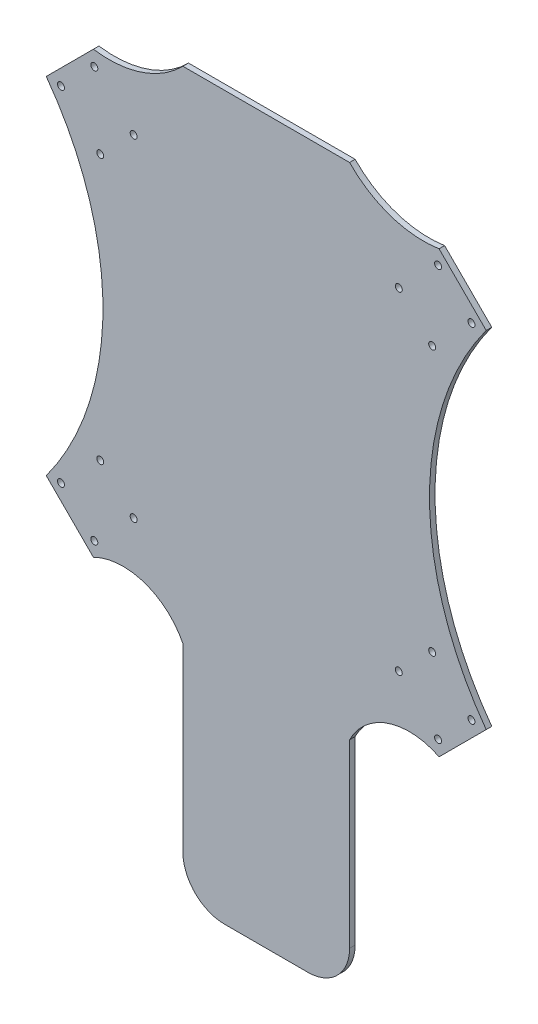
ISO-10303-21;
HEADER;
FILE_DESCRIPTION(('STEP AP214'),'2;1');
FILE_NAME('part.step','',(''),(''),'','','');
FILE_SCHEMA(('AUTOMOTIVE_DESIGN { 1 0 10303 214 1 1 1 1 }'));
ENDSEC;
DATA;
#1=APPLICATION_CONTEXT('core data for automotive mechanical design processes');
#2=APPLICATION_PROTOCOL_DEFINITION('international standard','automotive_design',2000,#1);
#3=PRODUCT_CONTEXT('',#1,'mechanical');
#4=PRODUCT('Part','Part','',(#3));
#5=PRODUCT_RELATED_PRODUCT_CATEGORY('part','',(#4));
#6=PRODUCT_DEFINITION_FORMATION('','',#4);
#7=PRODUCT_DEFINITION_CONTEXT('part definition',#1,'design');
#8=PRODUCT_DEFINITION('design','',#6,#7);
#9=PRODUCT_DEFINITION_SHAPE('','',#8);
#10=(LENGTH_UNIT() NAMED_UNIT(*) SI_UNIT(.MILLI.,.METRE.));
#11=(NAMED_UNIT(*) PLANE_ANGLE_UNIT() SI_UNIT($,.RADIAN.));
#12=(NAMED_UNIT(*) SI_UNIT($,.STERADIAN.) SOLID_ANGLE_UNIT());
#13=UNCERTAINTY_MEASURE_WITH_UNIT(LENGTH_MEASURE(1.E-05),#10,'distance_accuracy_value','');
#14=(GEOMETRIC_REPRESENTATION_CONTEXT(3) GLOBAL_UNCERTAINTY_ASSIGNED_CONTEXT((#13)) GLOBAL_UNIT_ASSIGNED_CONTEXT((#10,
#11,#12)) REPRESENTATION_CONTEXT('',''));
#15=CARTESIAN_POINT('',(0.,0.,0.));
#16=DIRECTION('',(0.,0.,1.));
#17=DIRECTION('',(1.,0.,0.));
#18=AXIS2_PLACEMENT_3D('',#15,#16,#17);
#19=CARTESIAN_POINT('',(70.710678118655,70.7106781186545,2.));
#20=DIRECTION('',(-0.70710678118655,-0.707106781186545,0.));
#21=DIRECTION('',(0.707106781186545,-0.70710678118655,0.));
#22=AXIS2_PLACEMENT_3D('',#19,#20,#21);
#23=PLANE('',#22);
#24=DIRECTION('',(-0.707106781186545,0.70710678118655,0.));
#25=VECTOR('',#24,1.);
#26=CARTESIAN_POINT('',(70.710678118655,70.7106781186545,0.));
#27=LINE('',#26,#25);
#28=CARTESIAN_POINT('',(79.1959594928695,62.2253967444399,0.));
#29=VERTEX_POINT('',#28);
#30=CARTESIAN_POINT('',(62.2253967444404,79.1959594928692,0.));
#31=VERTEX_POINT('',#30);
#32=EDGE_CURVE('E179',#29,#31,#27,.T.);
#33=ORIENTED_EDGE('',*,*,#32,.T.);
#34=DIRECTION('',(0.,0.,-1.));
#35=VECTOR('',#34,1.);
#36=CARTESIAN_POINT('',(62.2253967444404,79.1959594928692,2.));
#37=LINE('',#36,#35);
#38=CARTESIAN_POINT('',(62.2253967444404,79.1959594928692,2.));
#39=VERTEX_POINT('',#38);
#40=EDGE_CURVE('E11',#39,#31,#37,.T.);
#41=ORIENTED_EDGE('',*,*,#40,.F.);
#42=DIRECTION('',(-0.707106781186545,0.70710678118655,0.));
#43=VECTOR('',#42,1.);
#44=CARTESIAN_POINT('',(70.710678118655,70.7106781186545,2.));
#45=LINE('',#44,#43);
#46=CARTESIAN_POINT('',(79.1959594928695,62.2253967444399,2.));
#47=VERTEX_POINT('',#46);
#48=EDGE_CURVE('E219',#47,#39,#45,.T.);
#49=ORIENTED_EDGE('',*,*,#48,.F.);
#50=DIRECTION('',(0.,0.,-1.));
#51=VECTOR('',#50,1.);
#52=CARTESIAN_POINT('',(79.1959594928695,62.2253967444399,2.));
#53=LINE('',#52,#51);
#54=EDGE_CURVE('E51',#47,#29,#53,.T.);
#55=ORIENTED_EDGE('',*,*,#54,.T.);
#56=EDGE_LOOP('',(#33,#41,#49,#55));
#57=FACE_BOUND('',#56,.T.);
#58=ADVANCED_FACE('F35',(#57),#23,.F.);
#59=CARTESIAN_POINT('',(56.6326353834585,115.975976125653,2.));
#60=DIRECTION('',(0.,0.,-1.));
#61=DIRECTION('',(-1.,0.,0.));
#62=AXIS2_PLACEMENT_3D('',#59,#60,#61);
#63=CYLINDRICAL_SURFACE('',#62,37.2028037001073);
#64=CARTESIAN_POINT('',(56.6326353834585,115.975976125653,0.));
#65=DIRECTION('',(0.,0.,1.));
#66=DIRECTION('',(1.,0.,0.));
#67=AXIS2_PLACEMENT_3D('',#64,#65,#66);
#68=CIRCLE('',#67,37.2028037001073);
#69=CARTESIAN_POINT('',(30.,90.,0.));
#70=VERTEX_POINT('',#69);
#71=EDGE_CURVE('E181',#31,#70,#68,.F.);
#72=ORIENTED_EDGE('',*,*,#71,.T.);
#73=DIRECTION('',(0.,0.,-1.));
#74=VECTOR('',#73,1.);
#75=CARTESIAN_POINT('',(30.,90.,2.));
#76=LINE('',#75,#74);
#77=CARTESIAN_POINT('',(30.,90.,2.));
#78=VERTEX_POINT('',#77);
#79=EDGE_CURVE('E43',#78,#70,#76,.T.);
#80=ORIENTED_EDGE('',*,*,#79,.F.);
#81=CARTESIAN_POINT('',(56.6326353834585,115.975976125653,2.));
#82=DIRECTION('',(0.,0.,1.));
#83=DIRECTION('',(1.,0.,0.));
#84=AXIS2_PLACEMENT_3D('',#81,#82,#83);
#85=CIRCLE('',#84,37.2028037001073);
#86=EDGE_CURVE('E113',#39,#78,#85,.F.);
#87=ORIENTED_EDGE('',*,*,#86,.F.);
#88=ORIENTED_EDGE('',*,*,#40,.T.);
#89=EDGE_LOOP('',(#72,#80,#87,#88));
#90=FACE_BOUND('',#89,.T.);
#91=ADVANCED_FACE('F302',(#90),#63,.F.);
#92=CARTESIAN_POINT('',(0.,90.,2.));
#93=DIRECTION('',(0.,-1.,0.));
#94=DIRECTION('',(0.,0.,-1.));
#95=AXIS2_PLACEMENT_3D('',#92,#93,#94);
#96=PLANE('',#95);
#97=DIRECTION('',(-1.,0.,0.));
#98=VECTOR('',#97,1.);
#99=CARTESIAN_POINT('',(0.,90.,0.));
#100=LINE('',#99,#98);
#101=CARTESIAN_POINT('',(-30.,90.,0.));
#102=VERTEX_POINT('',#101);
#103=EDGE_CURVE('E184',#70,#102,#100,.T.);
#104=ORIENTED_EDGE('',*,*,#103,.T.);
#105=DIRECTION('',(0.,0.,-1.));
#106=VECTOR('',#105,1.);
#107=CARTESIAN_POINT('',(-30.,90.,2.));
#108=LINE('',#107,#106);
#109=CARTESIAN_POINT('',(-30.,90.,2.));
#110=VERTEX_POINT('',#109);
#111=EDGE_CURVE('E245',#110,#102,#108,.T.);
#112=ORIENTED_EDGE('',*,*,#111,.F.);
#113=DIRECTION('',(-1.,0.,0.));
#114=VECTOR('',#113,1.);
#115=CARTESIAN_POINT('',(0.,90.,2.));
#116=LINE('',#115,#114);
#117=EDGE_CURVE('E252',#78,#110,#116,.T.);
#118=ORIENTED_EDGE('',*,*,#117,.F.);
#119=ORIENTED_EDGE('',*,*,#79,.T.);
#120=EDGE_LOOP('',(#104,#112,#118,#119));
#121=FACE_BOUND('',#120,.T.);
#122=ADVANCED_FACE('F250',(#121),#96,.F.);
#123=CARTESIAN_POINT('',(-56.6326353834585,115.975976125653,2.));
#124=DIRECTION('',(0.,0.,-1.));
#125=DIRECTION('',(-1.,0.,0.));
#126=AXIS2_PLACEMENT_3D('',#123,#124,#125);
#127=CYLINDRICAL_SURFACE('',#126,37.2028037001073);
#128=CARTESIAN_POINT('',(-56.6326353834585,115.975976125653,0.));
#129=DIRECTION('',(0.,0.,1.));
#130=DIRECTION('',(1.,0.,0.));
#131=AXIS2_PLACEMENT_3D('',#128,#129,#130);
#132=CIRCLE('',#131,37.2028037001073);
#133=CARTESIAN_POINT('',(-62.2253967444404,79.1959594928692,0.));
#134=VERTEX_POINT('',#133);
#135=EDGE_CURVE('E187',#134,#102,#132,.T.);
#136=ORIENTED_EDGE('',*,*,#135,.F.);
#137=DIRECTION('',(0.,0.,-1.));
#138=VECTOR('',#137,1.);
#139=CARTESIAN_POINT('',(-62.2253967444404,79.1959594928692,2.));
#140=LINE('',#139,#138);
#141=CARTESIAN_POINT('',(-62.2253967444404,79.1959594928692,2.));
#142=VERTEX_POINT('',#141);
#143=EDGE_CURVE('E243',#142,#134,#140,.T.);
#144=ORIENTED_EDGE('',*,*,#143,.F.);
#145=CARTESIAN_POINT('',(-56.6326353834585,115.975976125653,2.));
#146=DIRECTION('',(0.,0.,1.));
#147=DIRECTION('',(1.,0.,0.));
#148=AXIS2_PLACEMENT_3D('',#145,#146,#147);
#149=CIRCLE('',#148,37.2028037001073);
#150=EDGE_CURVE('E262',#142,#110,#149,.T.);
#151=ORIENTED_EDGE('',*,*,#150,.T.);
#152=ORIENTED_EDGE('',*,*,#111,.T.);
#153=EDGE_LOOP('',(#136,#144,#151,#152));
#154=FACE_BOUND('',#153,.T.);
#155=ADVANCED_FACE('F259',(#154),#127,.F.);
#156=CARTESIAN_POINT('',(-70.710678118655,70.7106781186545,2.));
#157=DIRECTION('',(-0.70710678118655,0.707106781186545,0.));
#158=DIRECTION('',(-0.707106781186545,-0.70710678118655,0.));
#159=AXIS2_PLACEMENT_3D('',#156,#157,#158);
#160=PLANE('',#159);
#161=DIRECTION('',(0.707106781186545,0.70710678118655,0.));
#162=VECTOR('',#161,1.);
#163=CARTESIAN_POINT('',(-70.710678118655,70.7106781186545,0.));
#164=LINE('',#163,#162);
#165=CARTESIAN_POINT('',(-79.1959594928695,62.2253967444399,0.));
#166=VERTEX_POINT('',#165);
#167=EDGE_CURVE('E190',#166,#134,#164,.T.);
#168=ORIENTED_EDGE('',*,*,#167,.F.);
#169=DIRECTION('',(0.,0.,-1.));
#170=VECTOR('',#169,1.);
#171=CARTESIAN_POINT('',(-79.1959594928695,62.2253967444399,2.));
#172=LINE('',#171,#170);
#173=CARTESIAN_POINT('',(-79.1959594928695,62.2253967444399,2.));
#174=VERTEX_POINT('',#173);
#175=EDGE_CURVE('E241',#174,#166,#172,.T.);
#176=ORIENTED_EDGE('',*,*,#175,.F.);
#177=DIRECTION('',(0.707106781186545,0.70710678118655,0.));
#178=VECTOR('',#177,1.);
#179=CARTESIAN_POINT('',(-70.710678118655,70.7106781186545,2.));
#180=LINE('',#179,#178);
#181=EDGE_CURVE('E265',#174,#142,#180,.T.);
#182=ORIENTED_EDGE('',*,*,#181,.T.);
#183=ORIENTED_EDGE('',*,*,#143,.T.);
#184=EDGE_LOOP('',(#168,#176,#182,#183));
#185=FACE_BOUND('',#184,.T.);
#186=ADVANCED_FACE('F725',(#185),#160,.T.);
#187=CARTESIAN_POINT('',(-163.82245815415,-1.60235533378204E-13,2.));
#188=DIRECTION('',(0.,0.,-1.));
#189=DIRECTION('',(-1.,0.,0.));
#190=AXIS2_PLACEMENT_3D('',#187,#188,#189);
#191=CYLINDRICAL_SURFACE('',#190,105.04115515202);
#192=CARTESIAN_POINT('',(-163.82245815415,-1.60235533378204E-13,0.));
#193=DIRECTION('',(0.,0.,1.));
#194=DIRECTION('',(1.,0.,0.));
#195=AXIS2_PLACEMENT_3D('',#192,#193,#194);
#196=CIRCLE('',#195,105.04115515202);
#197=CARTESIAN_POINT('',(-79.1959594928692,-62.2253967444403,0.));
#198=VERTEX_POINT('',#197);
#199=EDGE_CURVE('E193',#166,#198,#196,.F.);
#200=ORIENTED_EDGE('',*,*,#199,.T.);
#201=DIRECTION('',(0.,0.,-1.));
#202=VECTOR('',#201,1.);
#203=CARTESIAN_POINT('',(-79.1959594928692,-62.2253967444403,2.));
#204=LINE('',#203,#202);
#205=CARTESIAN_POINT('',(-79.1959594928692,-62.2253967444403,2.));
#206=VERTEX_POINT('',#205);
#207=EDGE_CURVE('E238',#206,#198,#204,.T.);
#208=ORIENTED_EDGE('',*,*,#207,.F.);
#209=CARTESIAN_POINT('',(-163.82245815415,-1.60235533378204E-13,2.));
#210=DIRECTION('',(0.,0.,1.));
#211=DIRECTION('',(1.,0.,0.));
#212=AXIS2_PLACEMENT_3D('',#209,#210,#211);
#213=CIRCLE('',#212,105.04115515202);
#214=EDGE_CURVE('E267',#174,#206,#213,.F.);
#215=ORIENTED_EDGE('',*,*,#214,.F.);
#216=ORIENTED_EDGE('',*,*,#175,.T.);
#217=EDGE_LOOP('',(#200,#208,#215,#216));
#218=FACE_BOUND('',#217,.T.);
#219=ADVANCED_FACE('F716',(#218),#191,.F.);
#220=CARTESIAN_POINT('',(-70.7106781186544,-70.7106781186551,2.));
#221=DIRECTION('',(0.707106781186544,0.707106781186551,0.));
#222=DIRECTION('',(-0.707106781186551,0.707106781186544,0.));
#223=AXIS2_PLACEMENT_3D('',#220,#221,#222);
#224=PLANE('',#223);
#225=DIRECTION('',(0.707106781186551,-0.707106781186544,0.));
#226=VECTOR('',#225,1.);
#227=CARTESIAN_POINT('',(-70.7106781186544,-70.7106781186551,0.));
#228=LINE('',#227,#226);
#229=CARTESIAN_POINT('',(-62.2253967444395,-79.1959594928698,0.));
#230=VERTEX_POINT('',#229);
#231=EDGE_CURVE('E195',#198,#230,#228,.T.);
#232=ORIENTED_EDGE('',*,*,#231,.T.);
#233=DIRECTION('',(0.,0.,-1.));
#234=VECTOR('',#233,1.);
#235=CARTESIAN_POINT('',(-62.2253967444395,-79.1959594928698,2.));
#236=LINE('',#235,#234);
#237=CARTESIAN_POINT('',(-62.2253967444395,-79.1959594928698,2.));
#238=VERTEX_POINT('',#237);
#239=EDGE_CURVE('E235',#238,#230,#236,.T.);
#240=ORIENTED_EDGE('',*,*,#239,.F.);
#241=DIRECTION('',(0.707106781186551,-0.707106781186544,0.));
#242=VECTOR('',#241,1.);
#243=CARTESIAN_POINT('',(-70.7106781186544,-70.7106781186551,2.));
#244=LINE('',#243,#242);
#245=EDGE_CURVE('E273',#206,#238,#244,.T.);
#246=ORIENTED_EDGE('',*,*,#245,.F.);
#247=ORIENTED_EDGE('',*,*,#207,.T.);
#248=EDGE_LOOP('',(#232,#240,#246,#247));
#249=FACE_BOUND('',#248,.T.);
#250=ADVANCED_FACE('F707',(#249),#224,.F.);
#251=CARTESIAN_POINT('',(-51.5147186257848,-100.710678118655,2.));
#252=DIRECTION('',(0.,0.,-1.));
#253=DIRECTION('',(-1.,0.,0.));
#254=AXIS2_PLACEMENT_3D('',#251,#252,#253);
#255=CYLINDRICAL_SURFACE('',#254,24.0333464858334);
#256=CARTESIAN_POINT('',(-51.5147186257848,-100.710678118655,0.));
#257=DIRECTION('',(0.,0.,1.));
#258=DIRECTION('',(1.,0.,0.));
#259=AXIS2_PLACEMENT_3D('',#256,#257,#258);
#260=CIRCLE('',#259,24.0333464858334);
#261=CARTESIAN_POINT('',(-30.,-90.,0.));
#262=VERTEX_POINT('',#261);
#263=EDGE_CURVE('E197',#230,#262,#260,.F.);
#264=ORIENTED_EDGE('',*,*,#263,.T.);
#265=DIRECTION('',(0.,0.,-1.));
#266=VECTOR('',#265,1.);
#267=CARTESIAN_POINT('',(-30.,-90.,2.));
#268=LINE('',#267,#266);
#269=CARTESIAN_POINT('',(-30.,-90.,2.));
#270=VERTEX_POINT('',#269);
#271=EDGE_CURVE('E232',#270,#262,#268,.T.);
#272=ORIENTED_EDGE('',*,*,#271,.F.);
#273=CARTESIAN_POINT('',(-51.5147186257848,-100.710678118655,2.));
#274=DIRECTION('',(0.,0.,1.));
#275=DIRECTION('',(1.,0.,0.));
#276=AXIS2_PLACEMENT_3D('',#273,#274,#275);
#277=CIRCLE('',#276,24.0333464858334);
#278=EDGE_CURVE('E275',#238,#270,#277,.F.);
#279=ORIENTED_EDGE('',*,*,#278,.F.);
#280=ORIENTED_EDGE('',*,*,#239,.T.);
#281=EDGE_LOOP('',(#264,#272,#279,#280));
#282=FACE_BOUND('',#281,.T.);
#283=ADVANCED_FACE('F698',(#282),#255,.F.);
#284=CARTESIAN_POINT('',(-30.,0.,2.));
#285=DIRECTION('',(1.,0.,0.));
#286=DIRECTION('',(0.,1.,0.));
#287=AXIS2_PLACEMENT_3D('',#284,#285,#286);
#288=PLANE('',#287);
#289=DIRECTION('',(0.,-1.,0.));
#290=VECTOR('',#289,1.);
#291=CARTESIAN_POINT('',(-30.,0.,0.));
#292=LINE('',#291,#290);
#293=CARTESIAN_POINT('',(-30.,-155.,0.));
#294=VERTEX_POINT('',#293);
#295=EDGE_CURVE('E199',#262,#294,#292,.T.);
#296=ORIENTED_EDGE('',*,*,#295,.T.);
#297=DIRECTION('',(0.,0.,-1.));
#298=VECTOR('',#297,1.);
#299=CARTESIAN_POINT('',(-30.,-155.,2.));
#300=LINE('',#299,#298);
#301=CARTESIAN_POINT('',(-30.,-155.,2.));
#302=VERTEX_POINT('',#301);
#303=EDGE_CURVE('E230',#302,#294,#300,.T.);
#304=ORIENTED_EDGE('',*,*,#303,.F.);
#305=DIRECTION('',(0.,-1.,0.));
#306=VECTOR('',#305,1.);
#307=CARTESIAN_POINT('',(-30.,0.,2.));
#308=LINE('',#307,#306);
#309=EDGE_CURVE('E277',#270,#302,#308,.T.);
#310=ORIENTED_EDGE('',*,*,#309,.F.);
#311=ORIENTED_EDGE('',*,*,#271,.T.);
#312=EDGE_LOOP('',(#296,#304,#310,#311));
#313=FACE_BOUND('',#312,.T.);
#314=ADVANCED_FACE('F689',(#313),#288,.F.);
#315=CARTESIAN_POINT('',(-15.,-155.,2.));
#316=DIRECTION('',(0.,0.,-1.));
#317=DIRECTION('',(-1.,0.,0.));
#318=AXIS2_PLACEMENT_3D('',#315,#316,#317);
#319=CYLINDRICAL_SURFACE('',#318,15.);
#320=CARTESIAN_POINT('',(-15.,-155.,0.));
#321=DIRECTION('',(0.,0.,1.));
#322=DIRECTION('',(1.,0.,0.));
#323=AXIS2_PLACEMENT_3D('',#320,#321,#322);
#324=CIRCLE('',#323,15.);
#325=CARTESIAN_POINT('',(-14.9999999999999,-170.,0.));
#326=VERTEX_POINT('',#325);
#327=EDGE_CURVE('E202',#326,#294,#324,.F.);
#328=ORIENTED_EDGE('',*,*,#327,.F.);
#329=DIRECTION('',(0.,0.,-1.));
#330=VECTOR('',#329,1.);
#331=CARTESIAN_POINT('',(-14.9999999999999,-170.,2.));
#332=LINE('',#331,#330);
#333=CARTESIAN_POINT('',(-14.9999999999999,-170.,2.));
#334=VERTEX_POINT('',#333);
#335=EDGE_CURVE('E228',#334,#326,#332,.T.);
#336=ORIENTED_EDGE('',*,*,#335,.F.);
#337=CARTESIAN_POINT('',(-15.,-155.,2.));
#338=DIRECTION('',(0.,0.,1.));
#339=DIRECTION('',(1.,0.,0.));
#340=AXIS2_PLACEMENT_3D('',#337,#338,#339);
#341=CIRCLE('',#340,15.);
#342=EDGE_CURVE('E279',#334,#302,#341,.F.);
#343=ORIENTED_EDGE('',*,*,#342,.T.);
#344=ORIENTED_EDGE('',*,*,#303,.T.);
#345=EDGE_LOOP('',(#328,#336,#343,#344));
#346=FACE_BOUND('',#345,.T.);
#347=ADVANCED_FACE('F680',(#346),#319,.T.);
#348=CARTESIAN_POINT('',(0.,-170.,2.));
#349=DIRECTION('',(0.,1.,0.));
#350=DIRECTION('',(0.,0.,1.));
#351=AXIS2_PLACEMENT_3D('',#348,#349,#350);
#352=PLANE('',#351);
#353=DIRECTION('',(1.,0.,0.));
#354=VECTOR('',#353,1.);
#355=CARTESIAN_POINT('',(0.,-170.,0.));
#356=LINE('',#355,#354);
#357=CARTESIAN_POINT('',(14.9999999999999,-170.,0.));
#358=VERTEX_POINT('',#357);
#359=EDGE_CURVE('E205',#326,#358,#356,.T.);
#360=ORIENTED_EDGE('',*,*,#359,.T.);
#361=DIRECTION('',(0.,0.,-1.));
#362=VECTOR('',#361,1.);
#363=CARTESIAN_POINT('',(14.9999999999999,-170.,2.));
#364=LINE('',#363,#362);
#365=CARTESIAN_POINT('',(14.9999999999999,-170.,2.));
#366=VERTEX_POINT('',#365);
#367=EDGE_CURVE('E225',#366,#358,#364,.T.);
#368=ORIENTED_EDGE('',*,*,#367,.F.);
#369=DIRECTION('',(1.,0.,0.));
#370=VECTOR('',#369,1.);
#371=CARTESIAN_POINT('',(0.,-170.,2.));
#372=LINE('',#371,#370);
#373=EDGE_CURVE('E282',#334,#366,#372,.T.);
#374=ORIENTED_EDGE('',*,*,#373,.F.);
#375=ORIENTED_EDGE('',*,*,#335,.T.);
#376=EDGE_LOOP('',(#360,#368,#374,#375));
#377=FACE_BOUND('',#376,.T.);
#378=ADVANCED_FACE('F671',(#377),#352,.F.);
#379=CARTESIAN_POINT('',(15.,-155.,2.));
#380=DIRECTION('',(0.,0.,-1.));
#381=DIRECTION('',(-1.,0.,0.));
#382=AXIS2_PLACEMENT_3D('',#379,#380,#381);
#383=CYLINDRICAL_SURFACE('',#382,15.);
#384=CARTESIAN_POINT('',(15.,-155.,0.));
#385=DIRECTION('',(0.,0.,1.));
#386=DIRECTION('',(1.,0.,0.));
#387=AXIS2_PLACEMENT_3D('',#384,#385,#386);
#388=CIRCLE('',#387,15.);
#389=CARTESIAN_POINT('',(30.,-155.,0.));
#390=VERTEX_POINT('',#389);
#391=EDGE_CURVE('E207',#358,#390,#388,.T.);
#392=ORIENTED_EDGE('',*,*,#391,.T.);
#393=DIRECTION('',(0.,0.,-1.));
#394=VECTOR('',#393,1.);
#395=CARTESIAN_POINT('',(30.,-155.,2.));
#396=LINE('',#395,#394);
#397=CARTESIAN_POINT('',(30.,-155.,2.));
#398=VERTEX_POINT('',#397);
#399=EDGE_CURVE('E223',#398,#390,#396,.T.);
#400=ORIENTED_EDGE('',*,*,#399,.F.);
#401=CARTESIAN_POINT('',(15.,-155.,2.));
#402=DIRECTION('',(0.,0.,1.));
#403=DIRECTION('',(1.,0.,0.));
#404=AXIS2_PLACEMENT_3D('',#401,#402,#403);
#405=CIRCLE('',#404,15.);
#406=EDGE_CURVE('E284',#366,#398,#405,.T.);
#407=ORIENTED_EDGE('',*,*,#406,.F.);
#408=ORIENTED_EDGE('',*,*,#367,.T.);
#409=EDGE_LOOP('',(#392,#400,#407,#408));
#410=FACE_BOUND('',#409,.T.);
#411=ADVANCED_FACE('F663',(#410),#383,.T.);
#412=CARTESIAN_POINT('',(30.,0.,2.));
#413=DIRECTION('',(1.,0.,0.));
#414=DIRECTION('',(0.,0.,-1.));
#415=AXIS2_PLACEMENT_3D('',#412,#413,#414);
#416=PLANE('',#415);
#417=DIRECTION('',(0.,-1.,0.));
#418=VECTOR('',#417,1.);
#419=CARTESIAN_POINT('',(30.,0.,0.));
#420=LINE('',#419,#418);
#421=CARTESIAN_POINT('',(30.,-90.,0.));
#422=VERTEX_POINT('',#421);
#423=EDGE_CURVE('E210',#422,#390,#420,.T.);
#424=ORIENTED_EDGE('',*,*,#423,.F.);
#425=DIRECTION('',(0.,0.,-1.));
#426=VECTOR('',#425,1.);
#427=CARTESIAN_POINT('',(30.,-90.,2.));
#428=LINE('',#427,#426);
#429=CARTESIAN_POINT('',(30.,-90.,2.));
#430=VERTEX_POINT('',#429);
#431=EDGE_CURVE('E162',#430,#422,#428,.T.);
#432=ORIENTED_EDGE('',*,*,#431,.F.);
#433=DIRECTION('',(0.,-1.,0.));
#434=VECTOR('',#433,1.);
#435=CARTESIAN_POINT('',(30.,0.,2.));
#436=LINE('',#435,#434);
#437=EDGE_CURVE('E171',#430,#398,#436,.T.);
#438=ORIENTED_EDGE('',*,*,#437,.T.);
#439=ORIENTED_EDGE('',*,*,#399,.T.);
#440=EDGE_LOOP('',(#424,#432,#438,#439));
#441=FACE_BOUND('',#440,.T.);
#442=ADVANCED_FACE('F287',(#441),#416,.T.);
#443=CARTESIAN_POINT('',(51.5147186257848,-100.710678118655,2.));
#444=DIRECTION('',(0.,0.,-1.));
#445=DIRECTION('',(-1.,0.,0.));
#446=AXIS2_PLACEMENT_3D('',#443,#444,#445);
#447=CYLINDRICAL_SURFACE('',#446,24.0333464858334);
#448=CARTESIAN_POINT('',(51.5147186257848,-100.710678118655,0.));
#449=DIRECTION('',(0.,0.,1.));
#450=DIRECTION('',(1.,0.,0.));
#451=AXIS2_PLACEMENT_3D('',#448,#449,#450);
#452=CIRCLE('',#451,24.0333464858334);
#453=CARTESIAN_POINT('',(62.2253967444395,-79.1959594928698,0.));
#454=VERTEX_POINT('',#453);
#455=EDGE_CURVE('E158',#454,#422,#452,.T.);
#456=ORIENTED_EDGE('',*,*,#455,.F.);
#457=DIRECTION('',(0.,0.,-1.));
#458=VECTOR('',#457,1.);
#459=CARTESIAN_POINT('',(62.2253967444395,-79.1959594928698,2.));
#460=LINE('',#459,#458);
#461=CARTESIAN_POINT('',(62.2253967444395,-79.1959594928698,2.));
#462=VERTEX_POINT('',#461);
#463=EDGE_CURVE('E153',#462,#454,#460,.T.);
#464=ORIENTED_EDGE('',*,*,#463,.F.);
#465=CARTESIAN_POINT('',(51.5147186257848,-100.710678118655,2.));
#466=DIRECTION('',(0.,0.,1.));
#467=DIRECTION('',(1.,0.,0.));
#468=AXIS2_PLACEMENT_3D('',#465,#466,#467);
#469=CIRCLE('',#468,24.0333464858334);
#470=EDGE_CURVE('E156',#462,#430,#469,.T.);
#471=ORIENTED_EDGE('',*,*,#470,.T.);
#472=ORIENTED_EDGE('',*,*,#431,.T.);
#473=EDGE_LOOP('',(#456,#464,#471,#472));
#474=FACE_BOUND('',#473,.T.);
#475=ADVANCED_FACE('F155',(#474),#447,.F.);
#476=CARTESIAN_POINT('',(70.7106781186544,-70.7106781186551,2.));
#477=DIRECTION('',(0.707106781186544,-0.707106781186551,0.));
#478=DIRECTION('',(0.707106781186551,0.707106781186544,0.));
#479=AXIS2_PLACEMENT_3D('',#476,#477,#478);
#480=PLANE('',#479);
#481=DIRECTION('',(-0.707106781186551,-0.707106781186544,0.));
#482=VECTOR('',#481,1.);
#483=CARTESIAN_POINT('',(70.7106781186544,-70.7106781186551,0.));
#484=LINE('',#483,#482);
#485=CARTESIAN_POINT('',(79.1959594928692,-62.2253967444403,0.));
#486=VERTEX_POINT('',#485);
#487=EDGE_CURVE('E214',#486,#454,#484,.T.);
#488=ORIENTED_EDGE('',*,*,#487,.F.);
#489=DIRECTION('',(0.,0.,-1.));
#490=VECTOR('',#489,1.);
#491=CARTESIAN_POINT('',(79.1959594928692,-62.2253967444403,2.));
#492=LINE('',#491,#490);
#493=CARTESIAN_POINT('',(79.1959594928692,-62.2253967444403,2.));
#494=VERTEX_POINT('',#493);
#495=EDGE_CURVE('E101',#494,#486,#492,.T.);
#496=ORIENTED_EDGE('',*,*,#495,.F.);
#497=DIRECTION('',(-0.707106781186551,-0.707106781186544,0.));
#498=VECTOR('',#497,1.);
#499=CARTESIAN_POINT('',(70.7106781186544,-70.7106781186551,2.));
#500=LINE('',#499,#498);
#501=EDGE_CURVE('E169',#494,#462,#500,.T.);
#502=ORIENTED_EDGE('',*,*,#501,.T.);
#503=ORIENTED_EDGE('',*,*,#463,.T.);
#504=EDGE_LOOP('',(#488,#496,#502,#503));
#505=FACE_BOUND('',#504,.T.);
#506=ADVANCED_FACE('F173',(#505),#480,.T.);
#507=CARTESIAN_POINT('',(163.82245815415,1.07308884346123E-12,2.));
#508=DIRECTION('',(0.,0.,-1.));
#509=DIRECTION('',(-1.,0.,0.));
#510=AXIS2_PLACEMENT_3D('',#507,#508,#509);
#511=CYLINDRICAL_SURFACE('',#510,105.04115515202);
#512=CARTESIAN_POINT('',(163.82245815415,1.07308884346123E-12,0.));
#513=DIRECTION('',(0.,0.,1.));
#514=DIRECTION('',(1.,0.,0.));
#515=AXIS2_PLACEMENT_3D('',#512,#513,#514);
#516=CIRCLE('',#515,105.04115515202);
#517=EDGE_CURVE('E216',#29,#486,#516,.T.);
#518=ORIENTED_EDGE('',*,*,#517,.F.);
#519=ORIENTED_EDGE('',*,*,#54,.F.);
#520=CARTESIAN_POINT('',(163.82245815415,1.07308884346123E-12,2.));
#521=DIRECTION('',(0.,0.,1.));
#522=DIRECTION('',(1.,0.,0.));
#523=AXIS2_PLACEMENT_3D('',#520,#521,#522);
#524=CIRCLE('',#523,105.04115515202);
#525=EDGE_CURVE('E174',#47,#494,#524,.T.);
#526=ORIENTED_EDGE('',*,*,#525,.T.);
#527=ORIENTED_EDGE('',*,*,#495,.T.);
#528=EDGE_LOOP('',(#518,#519,#526,#527));
#529=FACE_BOUND('',#528,.T.);
#530=ADVANCED_FACE('F290',(#529),#511,.F.);
#531=CARTESIAN_POINT('',(0.,0.,2.));
#532=DIRECTION('',(0.,0.,1.));
#533=DIRECTION('',(1.,0.,0.));
#534=AXIS2_PLACEMENT_3D('',#531,#532,#533);
#535=PLANE('',#534);
#536=CARTESIAN_POINT('',(47.7297077300921,-59.7505230102632,2.));
#537=DIRECTION('',(0.,0.,1.));
#538=DIRECTION('',(-1.,0.,0.));
#539=AXIS2_PLACEMENT_3D('',#536,#537,#538);
#540=CIRCLE('',#539,1.25);
#541=CARTESIAN_POINT('',(46.4797077300921,-59.7505230102632,2.));
#542=VERTEX_POINT('',#541);
#543=EDGE_CURVE('E399',#542,#542,#540,.T.);
#544=ORIENTED_EDGE('',*,*,#543,.F.);
#545=EDGE_LOOP('',(#544));
#546=FACE_BOUND('',#545,.T.);
#547=CARTESIAN_POINT('',(61.8718433538231,-73.892658633994,2.));
#548=DIRECTION('',(0.,0.,1.));
#549=DIRECTION('',(-1.,0.,0.));
#550=AXIS2_PLACEMENT_3D('',#547,#548,#549);
#551=CIRCLE('',#550,1.25);
#552=CARTESIAN_POINT('',(60.6218433538231,-73.892658633994,2.));
#553=VERTEX_POINT('',#552);
#554=EDGE_CURVE('E393',#553,#553,#551,.T.);
#555=ORIENTED_EDGE('',*,*,#554,.F.);
#556=EDGE_LOOP('',(#555));
#557=FACE_BOUND('',#556,.T.);
#558=CARTESIAN_POINT('',(73.8926586339944,-61.8718433538227,2.));
#559=DIRECTION('',(0.,0.,1.));
#560=DIRECTION('',(1.,0.,0.));
#561=AXIS2_PLACEMENT_3D('',#558,#559,#560);
#562=CIRCLE('',#561,1.24999999999998);
#563=CARTESIAN_POINT('',(75.1426586339944,-61.8718433538227,2.));
#564=VERTEX_POINT('',#563);
#565=EDGE_CURVE('E387',#564,#564,#562,.T.);
#566=ORIENTED_EDGE('',*,*,#565,.F.);
#567=EDGE_LOOP('',(#566));
#568=FACE_BOUND('',#567,.T.);
#569=CARTESIAN_POINT('',(59.7505230102634,-47.7297077300918,2.));
#570=DIRECTION('',(0.,0.,1.));
#571=DIRECTION('',(1.,0.,0.));
#572=AXIS2_PLACEMENT_3D('',#569,#570,#571);
#573=CIRCLE('',#572,1.24999999999993);
#574=CARTESIAN_POINT('',(61.0005230102633,-47.7297077300918,2.));
#575=VERTEX_POINT('',#574);
#576=EDGE_CURVE('E381',#575,#575,#573,.T.);
#577=ORIENTED_EDGE('',*,*,#576,.F.);
#578=EDGE_LOOP('',(#577));
#579=FACE_BOUND('',#578,.T.);
#580=CARTESIAN_POINT('',(-73.8926586339944,-61.8718433538227,2.));
#581=DIRECTION('',(0.,0.,1.));
#582=DIRECTION('',(-1.,0.,0.));
#583=AXIS2_PLACEMENT_3D('',#580,#581,#582);
#584=CIRCLE('',#583,1.24999999999998);
#585=CARTESIAN_POINT('',(-75.1426586339944,-61.8718433538227,2.));
#586=VERTEX_POINT('',#585);
#587=EDGE_CURVE('E375',#586,#586,#584,.T.);
#588=ORIENTED_EDGE('',*,*,#587,.F.);
#589=EDGE_LOOP('',(#588));
#590=FACE_BOUND('',#589,.T.);
#591=CARTESIAN_POINT('',(-61.8718433538231,-73.892658633994,2.));
#592=DIRECTION('',(0.,0.,1.));
#593=DIRECTION('',(1.,0.,0.));
#594=AXIS2_PLACEMENT_3D('',#591,#592,#593);
#595=CIRCLE('',#594,1.25);
#596=CARTESIAN_POINT('',(-60.6218433538231,-73.892658633994,2.));
#597=VERTEX_POINT('',#596);
#598=EDGE_CURVE('E369',#597,#597,#595,.T.);
#599=ORIENTED_EDGE('',*,*,#598,.F.);
#600=EDGE_LOOP('',(#599));
#601=FACE_BOUND('',#600,.T.);
#602=CARTESIAN_POINT('',(-47.7297077300921,-59.7505230102632,2.));
#603=DIRECTION('',(0.,0.,1.));
#604=DIRECTION('',(1.,0.,0.));
#605=AXIS2_PLACEMENT_3D('',#602,#603,#604);
#606=CIRCLE('',#605,1.25);
#607=CARTESIAN_POINT('',(-46.4797077300921,-59.7505230102632,2.));
#608=VERTEX_POINT('',#607);
#609=EDGE_CURVE('E363',#608,#608,#606,.T.);
#610=ORIENTED_EDGE('',*,*,#609,.F.);
#611=EDGE_LOOP('',(#610));
#612=FACE_BOUND('',#611,.T.);
#613=CARTESIAN_POINT('',(-59.7505230102634,-47.7297077300918,2.));
#614=DIRECTION('',(0.,0.,1.));
#615=DIRECTION('',(-1.,0.,0.));
#616=AXIS2_PLACEMENT_3D('',#613,#614,#615);
#617=CIRCLE('',#616,1.24999999999993);
#618=CARTESIAN_POINT('',(-61.0005230102633,-47.7297077300918,2.));
#619=VERTEX_POINT('',#618);
#620=EDGE_CURVE('E357',#619,#619,#617,.T.);
#621=ORIENTED_EDGE('',*,*,#620,.F.);
#622=EDGE_LOOP('',(#621));
#623=FACE_BOUND('',#622,.T.);
#624=CARTESIAN_POINT('',(47.7297077300921,59.7505230102632,2.));
#625=DIRECTION('',(0.,0.,1.));
#626=DIRECTION('',(1.,0.,0.));
#627=AXIS2_PLACEMENT_3D('',#624,#625,#626);
#628=CIRCLE('',#627,1.25);
#629=CARTESIAN_POINT('',(48.9797077300921,59.7505230102632,2.));
#630=VERTEX_POINT('',#629);
#631=EDGE_CURVE('E351',#630,#630,#628,.T.);
#632=ORIENTED_EDGE('',*,*,#631,.F.);
#633=EDGE_LOOP('',(#632));
#634=FACE_BOUND('',#633,.T.);
#635=CARTESIAN_POINT('',(61.8718433538231,73.892658633994,2.));
#636=DIRECTION('',(0.,0.,1.));
#637=DIRECTION('',(1.,0.,0.));
#638=AXIS2_PLACEMENT_3D('',#635,#636,#637);
#639=CIRCLE('',#638,1.25);
#640=CARTESIAN_POINT('',(63.1218433538231,73.892658633994,2.));
#641=VERTEX_POINT('',#640);
#642=EDGE_CURVE('E345',#641,#641,#639,.T.);
#643=ORIENTED_EDGE('',*,*,#642,.F.);
#644=EDGE_LOOP('',(#643));
#645=FACE_BOUND('',#644,.T.);
#646=CARTESIAN_POINT('',(73.8926586339944,61.8718433538227,2.));
#647=DIRECTION('',(0.,0.,1.));
#648=DIRECTION('',(-1.,0.,0.));
#649=AXIS2_PLACEMENT_3D('',#646,#647,#648);
#650=CIRCLE('',#649,1.24999999999998);
#651=CARTESIAN_POINT('',(72.6426586339944,61.8718433538227,2.));
#652=VERTEX_POINT('',#651);
#653=EDGE_CURVE('E339',#652,#652,#650,.T.);
#654=ORIENTED_EDGE('',*,*,#653,.F.);
#655=EDGE_LOOP('',(#654));
#656=FACE_BOUND('',#655,.T.);
#657=CARTESIAN_POINT('',(59.7505230102634,47.7297077300918,2.));
#658=DIRECTION('',(0.,0.,1.));
#659=DIRECTION('',(-1.,0.,0.));
#660=AXIS2_PLACEMENT_3D('',#657,#658,#659);
#661=CIRCLE('',#660,1.24999999999993);
#662=CARTESIAN_POINT('',(58.5005230102635,47.7297077300918,2.));
#663=VERTEX_POINT('',#662);
#664=EDGE_CURVE('E333',#663,#663,#661,.T.);
#665=ORIENTED_EDGE('',*,*,#664,.F.);
#666=EDGE_LOOP('',(#665));
#667=FACE_BOUND('',#666,.T.);
#668=CARTESIAN_POINT('',(-47.7297077300921,59.7505230102632,2.));
#669=DIRECTION('',(0.,0.,1.));
#670=DIRECTION('',(-1.,0.,0.));
#671=AXIS2_PLACEMENT_3D('',#668,#669,#670);
#672=CIRCLE('',#671,1.25);
#673=CARTESIAN_POINT('',(-48.9797077300921,59.7505230102632,2.));
#674=VERTEX_POINT('',#673);
#675=EDGE_CURVE('E327',#674,#674,#672,.T.);
#676=ORIENTED_EDGE('',*,*,#675,.F.);
#677=EDGE_LOOP('',(#676));
#678=FACE_BOUND('',#677,.T.);
#679=CARTESIAN_POINT('',(-61.8718433538231,73.892658633994,2.));
#680=DIRECTION('',(0.,0.,1.));
#681=DIRECTION('',(-1.,0.,0.));
#682=AXIS2_PLACEMENT_3D('',#679,#680,#681);
#683=CIRCLE('',#682,1.25);
#684=CARTESIAN_POINT('',(-63.1218433538231,73.892658633994,2.));
#685=VERTEX_POINT('',#684);
#686=EDGE_CURVE('E321',#685,#685,#683,.T.);
#687=ORIENTED_EDGE('',*,*,#686,.F.);
#688=EDGE_LOOP('',(#687));
#689=FACE_BOUND('',#688,.T.);
#690=CARTESIAN_POINT('',(-59.7505230102634,47.7297077300918,2.));
#691=DIRECTION('',(0.,0.,1.));
#692=DIRECTION('',(1.,0.,0.));
#693=AXIS2_PLACEMENT_3D('',#690,#691,#692);
#694=CIRCLE('',#693,1.24999999999993);
#695=CARTESIAN_POINT('',(-58.5005230102635,47.7297077300918,2.));
#696=VERTEX_POINT('',#695);
#697=EDGE_CURVE('E315',#696,#696,#694,.T.);
#698=ORIENTED_EDGE('',*,*,#697,.F.);
#699=EDGE_LOOP('',(#698));
#700=FACE_BOUND('',#699,.T.);
#701=CARTESIAN_POINT('',(-73.8926586339944,61.8718433538227,2.));
#702=DIRECTION('',(0.,0.,1.));
#703=DIRECTION('',(1.,0.,0.));
#704=AXIS2_PLACEMENT_3D('',#701,#702,#703);
#705=CIRCLE('',#704,1.24999999999998);
#706=CARTESIAN_POINT('',(-72.6426586339944,61.8718433538227,2.));
#707=VERTEX_POINT('',#706);
#708=EDGE_CURVE('E309',#707,#707,#705,.T.);
#709=ORIENTED_EDGE('',*,*,#708,.F.);
#710=EDGE_LOOP('',(#709));
#711=FACE_BOUND('',#710,.T.);
#712=ORIENTED_EDGE('',*,*,#48,.T.);
#713=ORIENTED_EDGE('',*,*,#86,.T.);
#714=ORIENTED_EDGE('',*,*,#117,.T.);
#715=ORIENTED_EDGE('',*,*,#150,.F.);
#716=ORIENTED_EDGE('',*,*,#181,.F.);
#717=ORIENTED_EDGE('',*,*,#214,.T.);
#718=ORIENTED_EDGE('',*,*,#245,.T.);
#719=ORIENTED_EDGE('',*,*,#278,.T.);
#720=ORIENTED_EDGE('',*,*,#309,.T.);
#721=ORIENTED_EDGE('',*,*,#342,.F.);
#722=ORIENTED_EDGE('',*,*,#373,.T.);
#723=ORIENTED_EDGE('',*,*,#406,.T.);
#724=ORIENTED_EDGE('',*,*,#437,.F.);
#725=ORIENTED_EDGE('',*,*,#470,.F.);
#726=ORIENTED_EDGE('',*,*,#501,.F.);
#727=ORIENTED_EDGE('',*,*,#525,.F.);
#728=EDGE_LOOP('',(#712,#713,#714,#715,#716,#717,#718,#719,#720,#721,#722,#723,#724,#725,#726,#727));
#729=FACE_BOUND('',#728,.T.);
#730=ADVANCED_FACE('F167',(#546,#557,#568,#579,#590,#601,#612,#623,#634,#645,#656,#667,#678,
#689,#700,#711,#729),#535,.T.);
#731=CARTESIAN_POINT('',(0.,0.,0.));
#732=DIRECTION('',(0.,0.,1.));
#733=DIRECTION('',(1.,0.,0.));
#734=AXIS2_PLACEMENT_3D('',#731,#732,#733);
#735=PLANE('',#734);
#736=CARTESIAN_POINT('',(47.7297077300921,-59.7505230102632,0.));
#737=DIRECTION('',(0.,0.,1.));
#738=DIRECTION('',(-1.,0.,0.));
#739=AXIS2_PLACEMENT_3D('',#736,#737,#738);
#740=CIRCLE('',#739,1.25);
#741=CARTESIAN_POINT('',(46.4797077300921,-59.7505230102632,0.));
#742=VERTEX_POINT('',#741);
#743=EDGE_CURVE('E396',#742,#742,#740,.T.);
#744=ORIENTED_EDGE('',*,*,#743,.T.);
#745=EDGE_LOOP('',(#744));
#746=FACE_BOUND('',#745,.T.);
#747=CARTESIAN_POINT('',(61.8718433538231,-73.892658633994,0.));
#748=DIRECTION('',(0.,0.,1.));
#749=DIRECTION('',(-1.,0.,0.));
#750=AXIS2_PLACEMENT_3D('',#747,#748,#749);
#751=CIRCLE('',#750,1.25);
#752=CARTESIAN_POINT('',(60.6218433538231,-73.892658633994,0.));
#753=VERTEX_POINT('',#752);
#754=EDGE_CURVE('E390',#753,#753,#751,.T.);
#755=ORIENTED_EDGE('',*,*,#754,.T.);
#756=EDGE_LOOP('',(#755));
#757=FACE_BOUND('',#756,.T.);
#758=CARTESIAN_POINT('',(73.8926586339944,-61.8718433538227,0.));
#759=DIRECTION('',(0.,0.,1.));
#760=DIRECTION('',(1.,0.,0.));
#761=AXIS2_PLACEMENT_3D('',#758,#759,#760);
#762=CIRCLE('',#761,1.24999999999998);
#763=CARTESIAN_POINT('',(75.1426586339944,-61.8718433538227,0.));
#764=VERTEX_POINT('',#763);
#765=EDGE_CURVE('E384',#764,#764,#762,.T.);
#766=ORIENTED_EDGE('',*,*,#765,.T.);
#767=EDGE_LOOP('',(#766));
#768=FACE_BOUND('',#767,.T.);
#769=CARTESIAN_POINT('',(59.7505230102634,-47.7297077300918,0.));
#770=DIRECTION('',(0.,0.,1.));
#771=DIRECTION('',(1.,0.,0.));
#772=AXIS2_PLACEMENT_3D('',#769,#770,#771);
#773=CIRCLE('',#772,1.24999999999993);
#774=CARTESIAN_POINT('',(61.0005230102633,-47.7297077300918,0.));
#775=VERTEX_POINT('',#774);
#776=EDGE_CURVE('E378',#775,#775,#773,.T.);
#777=ORIENTED_EDGE('',*,*,#776,.T.);
#778=EDGE_LOOP('',(#777));
#779=FACE_BOUND('',#778,.T.);
#780=CARTESIAN_POINT('',(-73.8926586339944,-61.8718433538227,0.));
#781=DIRECTION('',(0.,0.,1.));
#782=DIRECTION('',(-1.,0.,0.));
#783=AXIS2_PLACEMENT_3D('',#780,#781,#782);
#784=CIRCLE('',#783,1.24999999999998);
#785=CARTESIAN_POINT('',(-75.1426586339944,-61.8718433538227,0.));
#786=VERTEX_POINT('',#785);
#787=EDGE_CURVE('E372',#786,#786,#784,.T.);
#788=ORIENTED_EDGE('',*,*,#787,.T.);
#789=EDGE_LOOP('',(#788));
#790=FACE_BOUND('',#789,.T.);
#791=CARTESIAN_POINT('',(-61.8718433538231,-73.892658633994,0.));
#792=DIRECTION('',(0.,0.,1.));
#793=DIRECTION('',(1.,0.,0.));
#794=AXIS2_PLACEMENT_3D('',#791,#792,#793);
#795=CIRCLE('',#794,1.25);
#796=CARTESIAN_POINT('',(-60.6218433538231,-73.892658633994,0.));
#797=VERTEX_POINT('',#796);
#798=EDGE_CURVE('E366',#797,#797,#795,.T.);
#799=ORIENTED_EDGE('',*,*,#798,.T.);
#800=EDGE_LOOP('',(#799));
#801=FACE_BOUND('',#800,.T.);
#802=CARTESIAN_POINT('',(-47.7297077300921,-59.7505230102632,0.));
#803=DIRECTION('',(0.,0.,1.));
#804=DIRECTION('',(1.,0.,0.));
#805=AXIS2_PLACEMENT_3D('',#802,#803,#804);
#806=CIRCLE('',#805,1.25);
#807=CARTESIAN_POINT('',(-46.4797077300921,-59.7505230102632,0.));
#808=VERTEX_POINT('',#807);
#809=EDGE_CURVE('E360',#808,#808,#806,.T.);
#810=ORIENTED_EDGE('',*,*,#809,.T.);
#811=EDGE_LOOP('',(#810));
#812=FACE_BOUND('',#811,.T.);
#813=CARTESIAN_POINT('',(-59.7505230102634,-47.7297077300918,0.));
#814=DIRECTION('',(0.,0.,1.));
#815=DIRECTION('',(-1.,0.,0.));
#816=AXIS2_PLACEMENT_3D('',#813,#814,#815);
#817=CIRCLE('',#816,1.24999999999993);
#818=CARTESIAN_POINT('',(-61.0005230102633,-47.7297077300918,0.));
#819=VERTEX_POINT('',#818);
#820=EDGE_CURVE('E354',#819,#819,#817,.T.);
#821=ORIENTED_EDGE('',*,*,#820,.T.);
#822=EDGE_LOOP('',(#821));
#823=FACE_BOUND('',#822,.T.);
#824=CARTESIAN_POINT('',(47.7297077300921,59.7505230102632,0.));
#825=DIRECTION('',(0.,0.,1.));
#826=DIRECTION('',(1.,0.,0.));
#827=AXIS2_PLACEMENT_3D('',#824,#825,#826);
#828=CIRCLE('',#827,1.25);
#829=CARTESIAN_POINT('',(48.9797077300921,59.7505230102632,0.));
#830=VERTEX_POINT('',#829);
#831=EDGE_CURVE('E348',#830,#830,#828,.T.);
#832=ORIENTED_EDGE('',*,*,#831,.T.);
#833=EDGE_LOOP('',(#832));
#834=FACE_BOUND('',#833,.T.);
#835=CARTESIAN_POINT('',(61.8718433538231,73.892658633994,0.));
#836=DIRECTION('',(0.,0.,1.));
#837=DIRECTION('',(1.,0.,0.));
#838=AXIS2_PLACEMENT_3D('',#835,#836,#837);
#839=CIRCLE('',#838,1.25);
#840=CARTESIAN_POINT('',(63.1218433538231,73.892658633994,0.));
#841=VERTEX_POINT('',#840);
#842=EDGE_CURVE('E342',#841,#841,#839,.T.);
#843=ORIENTED_EDGE('',*,*,#842,.T.);
#844=EDGE_LOOP('',(#843));
#845=FACE_BOUND('',#844,.T.);
#846=CARTESIAN_POINT('',(73.8926586339944,61.8718433538227,0.));
#847=DIRECTION('',(0.,0.,1.));
#848=DIRECTION('',(-1.,0.,0.));
#849=AXIS2_PLACEMENT_3D('',#846,#847,#848);
#850=CIRCLE('',#849,1.24999999999998);
#851=CARTESIAN_POINT('',(72.6426586339944,61.8718433538227,0.));
#852=VERTEX_POINT('',#851);
#853=EDGE_CURVE('E336',#852,#852,#850,.T.);
#854=ORIENTED_EDGE('',*,*,#853,.T.);
#855=EDGE_LOOP('',(#854));
#856=FACE_BOUND('',#855,.T.);
#857=CARTESIAN_POINT('',(59.7505230102634,47.7297077300918,0.));
#858=DIRECTION('',(0.,0.,1.));
#859=DIRECTION('',(-1.,0.,0.));
#860=AXIS2_PLACEMENT_3D('',#857,#858,#859);
#861=CIRCLE('',#860,1.24999999999993);
#862=CARTESIAN_POINT('',(58.5005230102635,47.7297077300918,0.));
#863=VERTEX_POINT('',#862);
#864=EDGE_CURVE('E330',#863,#863,#861,.T.);
#865=ORIENTED_EDGE('',*,*,#864,.T.);
#866=EDGE_LOOP('',(#865));
#867=FACE_BOUND('',#866,.T.);
#868=CARTESIAN_POINT('',(-47.7297077300921,59.7505230102632,0.));
#869=DIRECTION('',(0.,0.,1.));
#870=DIRECTION('',(-1.,0.,0.));
#871=AXIS2_PLACEMENT_3D('',#868,#869,#870);
#872=CIRCLE('',#871,1.25);
#873=CARTESIAN_POINT('',(-48.9797077300921,59.7505230102632,0.));
#874=VERTEX_POINT('',#873);
#875=EDGE_CURVE('E324',#874,#874,#872,.T.);
#876=ORIENTED_EDGE('',*,*,#875,.T.);
#877=EDGE_LOOP('',(#876));
#878=FACE_BOUND('',#877,.T.);
#879=CARTESIAN_POINT('',(-61.8718433538231,73.892658633994,0.));
#880=DIRECTION('',(0.,0.,1.));
#881=DIRECTION('',(-1.,0.,0.));
#882=AXIS2_PLACEMENT_3D('',#879,#880,#881);
#883=CIRCLE('',#882,1.25);
#884=CARTESIAN_POINT('',(-63.1218433538231,73.892658633994,0.));
#885=VERTEX_POINT('',#884);
#886=EDGE_CURVE('E318',#885,#885,#883,.T.);
#887=ORIENTED_EDGE('',*,*,#886,.T.);
#888=EDGE_LOOP('',(#887));
#889=FACE_BOUND('',#888,.T.);
#890=CARTESIAN_POINT('',(-59.7505230102634,47.7297077300918,0.));
#891=DIRECTION('',(0.,0.,1.));
#892=DIRECTION('',(1.,0.,0.));
#893=AXIS2_PLACEMENT_3D('',#890,#891,#892);
#894=CIRCLE('',#893,1.24999999999993);
#895=CARTESIAN_POINT('',(-58.5005230102635,47.7297077300918,0.));
#896=VERTEX_POINT('',#895);
#897=EDGE_CURVE('E312',#896,#896,#894,.T.);
#898=ORIENTED_EDGE('',*,*,#897,.T.);
#899=EDGE_LOOP('',(#898));
#900=FACE_BOUND('',#899,.T.);
#901=CARTESIAN_POINT('',(-73.8926586339944,61.8718433538227,0.));
#902=DIRECTION('',(0.,0.,1.));
#903=DIRECTION('',(1.,0.,0.));
#904=AXIS2_PLACEMENT_3D('',#901,#902,#903);
#905=CIRCLE('',#904,1.24999999999998);
#906=CARTESIAN_POINT('',(-72.6426586339944,61.8718433538227,0.));
#907=VERTEX_POINT('',#906);
#908=EDGE_CURVE('E182',#907,#907,#905,.T.);
#909=ORIENTED_EDGE('',*,*,#908,.T.);
#910=EDGE_LOOP('',(#909));
#911=FACE_BOUND('',#910,.T.);
#912=ORIENTED_EDGE('',*,*,#32,.F.);
#913=ORIENTED_EDGE('',*,*,#517,.T.);
#914=ORIENTED_EDGE('',*,*,#487,.T.);
#915=ORIENTED_EDGE('',*,*,#455,.T.);
#916=ORIENTED_EDGE('',*,*,#423,.T.);
#917=ORIENTED_EDGE('',*,*,#391,.F.);
#918=ORIENTED_EDGE('',*,*,#359,.F.);
#919=ORIENTED_EDGE('',*,*,#327,.T.);
#920=ORIENTED_EDGE('',*,*,#295,.F.);
#921=ORIENTED_EDGE('',*,*,#263,.F.);
#922=ORIENTED_EDGE('',*,*,#231,.F.);
#923=ORIENTED_EDGE('',*,*,#199,.F.);
#924=ORIENTED_EDGE('',*,*,#167,.T.);
#925=ORIENTED_EDGE('',*,*,#135,.T.);
#926=ORIENTED_EDGE('',*,*,#103,.F.);
#927=ORIENTED_EDGE('',*,*,#71,.F.);
#928=EDGE_LOOP('',(#912,#913,#914,#915,#916,#917,#918,#919,#920,#921,#922,#923,#924,#925,#926,#927));
#929=FACE_BOUND('',#928,.T.);
#930=ADVANCED_FACE('F254',(#746,#757,#768,#779,#790,#801,#812,#823,#834,#845,#856,#867,#878,
#889,#900,#911,#929),#735,.F.);
#931=CARTESIAN_POINT('',(-73.8926586339944,61.8718433538227,0.));
#932=DIRECTION('',(0.,0.,1.));
#933=DIRECTION('',(1.,0.,0.));
#934=AXIS2_PLACEMENT_3D('',#931,#932,#933);
#935=CYLINDRICAL_SURFACE('',#934,1.24999999999998);
#936=ORIENTED_EDGE('',*,*,#908,.F.);
#937=EDGE_LOOP('',(#936));
#938=FACE_BOUND('',#937,.T.);
#939=ORIENTED_EDGE('',*,*,#708,.T.);
#940=EDGE_LOOP('',(#939));
#941=FACE_BOUND('',#940,.T.);
#942=ADVANCED_FACE('F444',(#938,#941),#935,.F.);
#943=CARTESIAN_POINT('',(-59.7505230102634,47.7297077300918,0.));
#944=DIRECTION('',(0.,0.,1.));
#945=DIRECTION('',(1.,0.,0.));
#946=AXIS2_PLACEMENT_3D('',#943,#944,#945);
#947=CYLINDRICAL_SURFACE('',#946,1.24999999999993);
#948=ORIENTED_EDGE('',*,*,#897,.F.);
#949=EDGE_LOOP('',(#948));
#950=FACE_BOUND('',#949,.T.);
#951=ORIENTED_EDGE('',*,*,#697,.T.);
#952=EDGE_LOOP('',(#951));
#953=FACE_BOUND('',#952,.T.);
#954=ADVANCED_FACE('F446',(#950,#953),#947,.F.);
#955=CARTESIAN_POINT('',(-61.8718433538231,73.892658633994,0.));
#956=DIRECTION('',(0.,0.,1.));
#957=DIRECTION('',(1.,0.,0.));
#958=AXIS2_PLACEMENT_3D('',#955,#956,#957);
#959=CYLINDRICAL_SURFACE('',#958,1.25);
#960=ORIENTED_EDGE('',*,*,#886,.F.);
#961=EDGE_LOOP('',(#960));
#962=FACE_BOUND('',#961,.T.);
#963=ORIENTED_EDGE('',*,*,#686,.T.);
#964=EDGE_LOOP('',(#963));
#965=FACE_BOUND('',#964,.T.);
#966=ADVANCED_FACE('F453',(#962,#965),#959,.F.);
#967=CARTESIAN_POINT('',(-47.7297077300921,59.7505230102632,0.));
#968=DIRECTION('',(0.,0.,1.));
#969=DIRECTION('',(1.,0.,0.));
#970=AXIS2_PLACEMENT_3D('',#967,#968,#969);
#971=CYLINDRICAL_SURFACE('',#970,1.25);
#972=ORIENTED_EDGE('',*,*,#875,.F.);
#973=EDGE_LOOP('',(#972));
#974=FACE_BOUND('',#973,.T.);
#975=ORIENTED_EDGE('',*,*,#675,.T.);
#976=EDGE_LOOP('',(#975));
#977=FACE_BOUND('',#976,.T.);
#978=ADVANCED_FACE('F460',(#974,#977),#971,.F.);
#979=CARTESIAN_POINT('',(59.7505230102634,47.7297077300918,0.));
#980=DIRECTION('',(0.,0.,1.));
#981=DIRECTION('',(1.,0.,0.));
#982=AXIS2_PLACEMENT_3D('',#979,#980,#981);
#983=CYLINDRICAL_SURFACE('',#982,1.24999999999993);
#984=ORIENTED_EDGE('',*,*,#864,.F.);
#985=EDGE_LOOP('',(#984));
#986=FACE_BOUND('',#985,.T.);
#987=ORIENTED_EDGE('',*,*,#664,.T.);
#988=EDGE_LOOP('',(#987));
#989=FACE_BOUND('',#988,.T.);
#990=ADVANCED_FACE('F464',(#986,#989),#983,.F.);
#991=CARTESIAN_POINT('',(73.8926586339944,61.8718433538227,0.));
#992=DIRECTION('',(0.,0.,1.));
#993=DIRECTION('',(1.,0.,0.));
#994=AXIS2_PLACEMENT_3D('',#991,#992,#993);
#995=CYLINDRICAL_SURFACE('',#994,1.24999999999998);
#996=ORIENTED_EDGE('',*,*,#853,.F.);
#997=EDGE_LOOP('',(#996));
#998=FACE_BOUND('',#997,.T.);
#999=ORIENTED_EDGE('',*,*,#653,.T.);
#1000=EDGE_LOOP('',(#999));
#1001=FACE_BOUND('',#1000,.T.);
#1002=ADVANCED_FACE('F468',(#998,#1001),#995,.F.);
#1003=CARTESIAN_POINT('',(61.8718433538231,73.892658633994,0.));
#1004=DIRECTION('',(0.,0.,1.));
#1005=DIRECTION('',(1.,0.,0.));
#1006=AXIS2_PLACEMENT_3D('',#1003,#1004,#1005);
#1007=CYLINDRICAL_SURFACE('',#1006,1.25);
#1008=ORIENTED_EDGE('',*,*,#842,.F.);
#1009=EDGE_LOOP('',(#1008));
#1010=FACE_BOUND('',#1009,.T.);
#1011=ORIENTED_EDGE('',*,*,#642,.T.);
#1012=EDGE_LOOP('',(#1011));
#1013=FACE_BOUND('',#1012,.T.);
#1014=ADVANCED_FACE('F472',(#1010,#1013),#1007,.F.);
#1015=CARTESIAN_POINT('',(47.7297077300921,59.7505230102632,0.));
#1016=DIRECTION('',(0.,0.,1.));
#1017=DIRECTION('',(1.,0.,0.));
#1018=AXIS2_PLACEMENT_3D('',#1015,#1016,#1017);
#1019=CYLINDRICAL_SURFACE('',#1018,1.25);
#1020=ORIENTED_EDGE('',*,*,#831,.F.);
#1021=EDGE_LOOP('',(#1020));
#1022=FACE_BOUND('',#1021,.T.);
#1023=ORIENTED_EDGE('',*,*,#631,.T.);
#1024=EDGE_LOOP('',(#1023));
#1025=FACE_BOUND('',#1024,.T.);
#1026=ADVANCED_FACE('F476',(#1022,#1025),#1019,.F.);
#1027=CARTESIAN_POINT('',(-59.7505230102634,-47.7297077300918,0.));
#1028=DIRECTION('',(0.,0.,1.));
#1029=DIRECTION('',(1.,0.,0.));
#1030=AXIS2_PLACEMENT_3D('',#1027,#1028,#1029);
#1031=CYLINDRICAL_SURFACE('',#1030,1.24999999999993);
#1032=ORIENTED_EDGE('',*,*,#820,.F.);
#1033=EDGE_LOOP('',(#1032));
#1034=FACE_BOUND('',#1033,.T.);
#1035=ORIENTED_EDGE('',*,*,#620,.T.);
#1036=EDGE_LOOP('',(#1035));
#1037=FACE_BOUND('',#1036,.T.);
#1038=ADVANCED_FACE('F480',(#1034,#1037),#1031,.F.);
#1039=CARTESIAN_POINT('',(-47.7297077300921,-59.7505230102632,0.));
#1040=DIRECTION('',(0.,0.,1.));
#1041=DIRECTION('',(1.,0.,0.));
#1042=AXIS2_PLACEMENT_3D('',#1039,#1040,#1041);
#1043=CYLINDRICAL_SURFACE('',#1042,1.25);
#1044=ORIENTED_EDGE('',*,*,#809,.F.);
#1045=EDGE_LOOP('',(#1044));
#1046=FACE_BOUND('',#1045,.T.);
#1047=ORIENTED_EDGE('',*,*,#609,.T.);
#1048=EDGE_LOOP('',(#1047));
#1049=FACE_BOUND('',#1048,.T.);
#1050=ADVANCED_FACE('F484',(#1046,#1049),#1043,.F.);
#1051=CARTESIAN_POINT('',(-61.8718433538231,-73.892658633994,0.));
#1052=DIRECTION('',(0.,0.,1.));
#1053=DIRECTION('',(1.,0.,0.));
#1054=AXIS2_PLACEMENT_3D('',#1051,#1052,#1053);
#1055=CYLINDRICAL_SURFACE('',#1054,1.25);
#1056=ORIENTED_EDGE('',*,*,#798,.F.);
#1057=EDGE_LOOP('',(#1056));
#1058=FACE_BOUND('',#1057,.T.);
#1059=ORIENTED_EDGE('',*,*,#598,.T.);
#1060=EDGE_LOOP('',(#1059));
#1061=FACE_BOUND('',#1060,.T.);
#1062=ADVANCED_FACE('F488',(#1058,#1061),#1055,.F.);
#1063=CARTESIAN_POINT('',(-73.8926586339944,-61.8718433538227,0.));
#1064=DIRECTION('',(0.,0.,1.));
#1065=DIRECTION('',(1.,0.,0.));
#1066=AXIS2_PLACEMENT_3D('',#1063,#1064,#1065);
#1067=CYLINDRICAL_SURFACE('',#1066,1.24999999999998);
#1068=ORIENTED_EDGE('',*,*,#787,.F.);
#1069=EDGE_LOOP('',(#1068));
#1070=FACE_BOUND('',#1069,.T.);
#1071=ORIENTED_EDGE('',*,*,#587,.T.);
#1072=EDGE_LOOP('',(#1071));
#1073=FACE_BOUND('',#1072,.T.);
#1074=ADVANCED_FACE('F492',(#1070,#1073),#1067,.F.);
#1075=CARTESIAN_POINT('',(59.7505230102634,-47.7297077300918,0.));
#1076=DIRECTION('',(0.,0.,1.));
#1077=DIRECTION('',(1.,0.,0.));
#1078=AXIS2_PLACEMENT_3D('',#1075,#1076,#1077);
#1079=CYLINDRICAL_SURFACE('',#1078,1.24999999999993);
#1080=ORIENTED_EDGE('',*,*,#776,.F.);
#1081=EDGE_LOOP('',(#1080));
#1082=FACE_BOUND('',#1081,.T.);
#1083=ORIENTED_EDGE('',*,*,#576,.T.);
#1084=EDGE_LOOP('',(#1083));
#1085=FACE_BOUND('',#1084,.T.);
#1086=ADVANCED_FACE('F496',(#1082,#1085),#1079,.F.);
#1087=CARTESIAN_POINT('',(73.8926586339944,-61.8718433538227,0.));
#1088=DIRECTION('',(0.,0.,1.));
#1089=DIRECTION('',(1.,0.,0.));
#1090=AXIS2_PLACEMENT_3D('',#1087,#1088,#1089);
#1091=CYLINDRICAL_SURFACE('',#1090,1.24999999999998);
#1092=ORIENTED_EDGE('',*,*,#765,.F.);
#1093=EDGE_LOOP('',(#1092));
#1094=FACE_BOUND('',#1093,.T.);
#1095=ORIENTED_EDGE('',*,*,#565,.T.);
#1096=EDGE_LOOP('',(#1095));
#1097=FACE_BOUND('',#1096,.T.);
#1098=ADVANCED_FACE('F500',(#1094,#1097),#1091,.F.);
#1099=CARTESIAN_POINT('',(61.8718433538231,-73.892658633994,0.));
#1100=DIRECTION('',(0.,0.,1.));
#1101=DIRECTION('',(1.,0.,0.));
#1102=AXIS2_PLACEMENT_3D('',#1099,#1100,#1101);
#1103=CYLINDRICAL_SURFACE('',#1102,1.25);
#1104=ORIENTED_EDGE('',*,*,#754,.F.);
#1105=EDGE_LOOP('',(#1104));
#1106=FACE_BOUND('',#1105,.T.);
#1107=ORIENTED_EDGE('',*,*,#554,.T.);
#1108=EDGE_LOOP('',(#1107));
#1109=FACE_BOUND('',#1108,.T.);
#1110=ADVANCED_FACE('F410',(#1106,#1109),#1103,.F.);
#1111=CARTESIAN_POINT('',(47.7297077300921,-59.7505230102632,0.));
#1112=DIRECTION('',(0.,0.,1.));
#1113=DIRECTION('',(1.,0.,0.));
#1114=AXIS2_PLACEMENT_3D('',#1111,#1112,#1113);
#1115=CYLINDRICAL_SURFACE('',#1114,1.25);
#1116=ORIENTED_EDGE('',*,*,#743,.F.);
#1117=EDGE_LOOP('',(#1116));
#1118=FACE_BOUND('',#1117,.T.);
#1119=ORIENTED_EDGE('',*,*,#543,.T.);
#1120=EDGE_LOOP('',(#1119));
#1121=FACE_BOUND('',#1120,.T.);
#1122=ADVANCED_FACE('F407',(#1118,#1121),#1115,.F.);
#1123=CLOSED_SHELL('',(#58,#91,#122,#155,#186,#219,#250,#283,#314,#347,#378,#411,#442,#475,#506,
#530,#730,#930,#942,#954,#966,#978,#990,#1002,#1014,#1026,#1038,#1050,#1062,#1074,#1086,#1098,
#1110,#1122));
#1124=MANIFOLD_SOLID_BREP('B2',#1123);
#1125=ADVANCED_BREP_SHAPE_REPRESENTATION('',(#18,#1124),#14);
#1126=SHAPE_DEFINITION_REPRESENTATION(#9,#1125);
ENDSEC;
END-ISO-10303-21;
